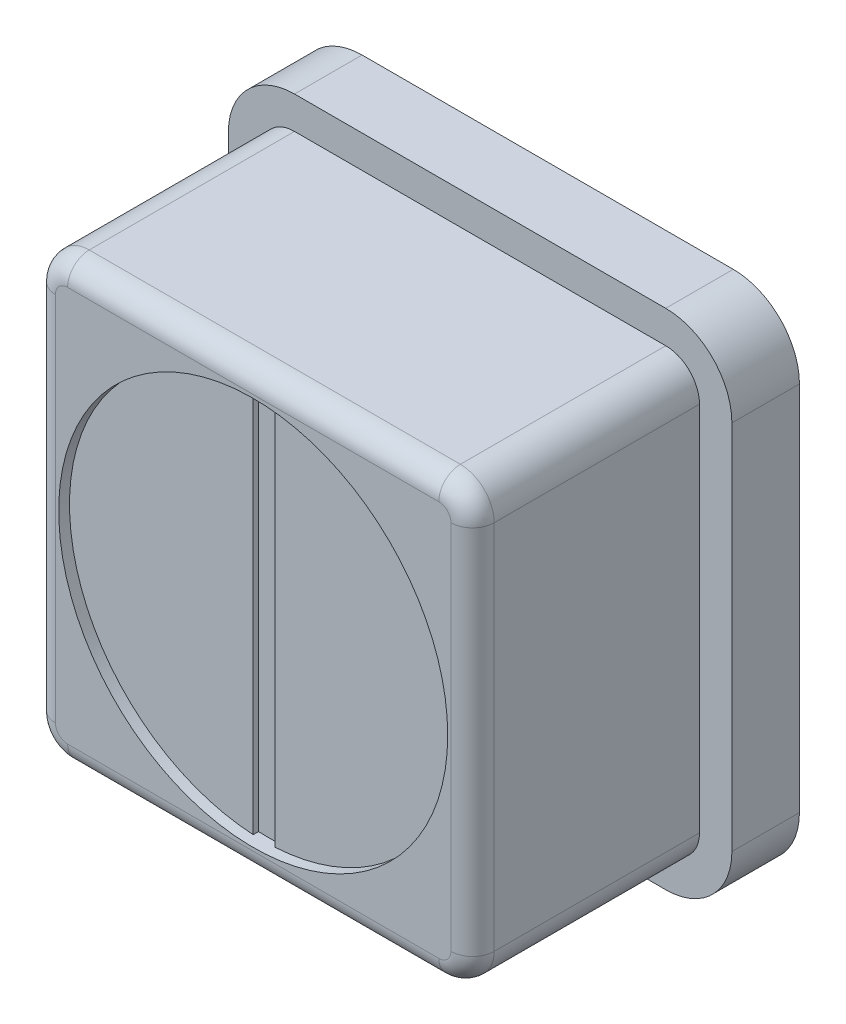
ISO-10303-21;
HEADER;
FILE_DESCRIPTION(('STEP AP214'),'2;1');
FILE_NAME('part.step','',(''),(''),'','','');
FILE_SCHEMA(('AUTOMOTIVE_DESIGN { 1 0 10303 214 1 1 1 1 }'));
ENDSEC;
DATA;
#1=APPLICATION_CONTEXT('core data for automotive mechanical design processes');
#2=APPLICATION_PROTOCOL_DEFINITION('international standard','automotive_design',2000,#1);
#3=PRODUCT_CONTEXT('',#1,'mechanical');
#4=PRODUCT('Part','Part','',(#3));
#5=PRODUCT_RELATED_PRODUCT_CATEGORY('part','',(#4));
#6=PRODUCT_DEFINITION_FORMATION('','',#4);
#7=PRODUCT_DEFINITION_CONTEXT('part definition',#1,'design');
#8=PRODUCT_DEFINITION('design','',#6,#7);
#9=PRODUCT_DEFINITION_SHAPE('','',#8);
#10=(LENGTH_UNIT() NAMED_UNIT(*) SI_UNIT(.MILLI.,.METRE.));
#11=(NAMED_UNIT(*) PLANE_ANGLE_UNIT() SI_UNIT($,.RADIAN.));
#12=(NAMED_UNIT(*) SI_UNIT($,.STERADIAN.) SOLID_ANGLE_UNIT());
#13=UNCERTAINTY_MEASURE_WITH_UNIT(LENGTH_MEASURE(1.E-05),#10,'distance_accuracy_value','');
#14=(GEOMETRIC_REPRESENTATION_CONTEXT(3) GLOBAL_UNCERTAINTY_ASSIGNED_CONTEXT((#13)) GLOBAL_UNIT_ASSIGNED_CONTEXT((#10,
#11,#12)) REPRESENTATION_CONTEXT('',''));
#15=CARTESIAN_POINT('',(0.,0.,0.));
#16=DIRECTION('',(0.,0.,1.));
#17=DIRECTION('',(1.,0.,0.));
#18=AXIS2_PLACEMENT_3D('',#15,#16,#17);
#19=CARTESIAN_POINT('',(0.,0.,-0.254000000000004));
#20=DIRECTION('',(0.,0.,1.));
#21=DIRECTION('',(1.,0.,0.));
#22=AXIS2_PLACEMENT_3D('',#19,#20,#21);
#23=PLANE('',#22);
#24=CARTESIAN_POINT('',(0.,0.,-0.254000000000004));
#25=DIRECTION('',(0.,0.,1.));
#26=DIRECTION('',(1.,0.,0.));
#27=AXIS2_PLACEMENT_3D('',#24,#25,#26);
#28=CIRCLE('',#27,4.572);
#29=CARTESIAN_POINT('',(-0.253999999999907,4.56493899192506,-0.25399999999999));
#30=VERTEX_POINT('',#29);
#31=CARTESIAN_POINT('',(-0.254000000000011,-4.56493899192553,-0.253999999999997));
#32=VERTEX_POINT('',#31);
#33=EDGE_CURVE('E357',#30,#32,#28,.T.);
#34=ORIENTED_EDGE('',*,*,#33,.T.);
#35=DIRECTION('',(0.,1.,0.));
#36=VECTOR('',#35,1.);
#37=CARTESIAN_POINT('',(-0.254000000000018,-2.35922392732846E-13,-0.253999999999997));
#38=LINE('',#37,#36);
#39=EDGE_CURVE('E301',#32,#30,#38,.T.);
#40=ORIENTED_EDGE('',*,*,#39,.T.);
#41=EDGE_LOOP('',(#34,#40));
#42=FACE_BOUND('',#41,.T.);
#43=ADVANCED_FACE('F55',(#42),#23,.T.);
#44=CARTESIAN_POINT('',(4.3624499538877,4.36244995397701,-5.33399999999997));
#45=DIRECTION('',(0.,0.,1.));
#46=DIRECTION('',(1.,0.,0.));
#47=AXIS2_PLACEMENT_3D('',#44,#45,#46);
#48=CYLINDRICAL_SURFACE('',#47,0.793750000000093);
#49=DIRECTION('',(0.,0.,1.));
#50=VECTOR('',#49,1.);
#51=CARTESIAN_POINT('',(4.3624468932103,5.15619995397119,-5.33399999999997));
#52=LINE('',#51,#50);
#53=CARTESIAN_POINT('',(4.3624468932103,5.15619995397119,-5.33399999999997));
#54=VERTEX_POINT('',#53);
#55=CARTESIAN_POINT('',(4.3624468932103,5.15619995397122,-0.50799999999996));
#56=VERTEX_POINT('',#55);
#57=EDGE_CURVE('E439',#54,#56,#52,.T.);
#58=ORIENTED_EDGE('',*,*,#57,.T.);
#59=CARTESIAN_POINT('',(4.3624499538877,4.36244995397701,-0.507999999999974));
#60=DIRECTION('',(0.,0.,1.));
#61=DIRECTION('',(1.,0.,0.));
#62=AXIS2_PLACEMENT_3D('',#59,#60,#61);
#63=CIRCLE('',#62,0.793750000000093);
#64=CARTESIAN_POINT('',(5.15619995388178,4.36244689321312,-0.507999999999974));
#65=VERTEX_POINT('',#64);
#66=EDGE_CURVE('E13',#56,#65,#63,.F.);
#67=ORIENTED_EDGE('',*,*,#66,.T.);
#68=DIRECTION('',(0.,0.,1.));
#69=VECTOR('',#68,1.);
#70=CARTESIAN_POINT('',(5.15619995388179,4.36244689321312,-5.33399999999997));
#71=LINE('',#70,#69);
#72=CARTESIAN_POINT('',(5.15619995388179,4.36244689321312,-5.33399999999997));
#73=VERTEX_POINT('',#72);
#74=EDGE_CURVE('E438',#73,#65,#71,.T.);
#75=ORIENTED_EDGE('',*,*,#74,.F.);
#76=CARTESIAN_POINT('',(4.3624499538877,4.36244995397701,-5.33399999999997));
#77=DIRECTION('',(0.,0.,1.));
#78=DIRECTION('',(1.,0.,0.));
#79=AXIS2_PLACEMENT_3D('',#76,#77,#78);
#80=CIRCLE('',#79,0.793750000000093);
#81=EDGE_CURVE('E365',#73,#54,#80,.T.);
#82=ORIENTED_EDGE('',*,*,#81,.T.);
#83=EDGE_LOOP('',(#58,#67,#75,#82));
#84=FACE_BOUND('',#83,.T.);
#85=ADVANCED_FACE('F564',(#84),#48,.T.);
#86=CARTESIAN_POINT('',(5.15619995388188,-4.36244689320725,-5.33399999999997));
#87=DIRECTION('',(1.,0.,0.));
#88=DIRECTION('',(0.,1.,0.));
#89=AXIS2_PLACEMENT_3D('',#86,#87,#88);
#90=PLANE('',#89);
#91=ORIENTED_EDGE('',*,*,#74,.T.);
#92=DIRECTION('',(0.,1.,0.));
#93=VECTOR('',#92,1.);
#94=CARTESIAN_POINT('',(5.15619995388187,-4.36244689320725,-0.507999999999967));
#95=LINE('',#94,#93);
#96=CARTESIAN_POINT('',(5.15619995388187,-4.36244689320725,-0.507999999999967));
#97=VERTEX_POINT('',#96);
#98=EDGE_CURVE('E409',#65,#97,#95,.F.);
#99=ORIENTED_EDGE('',*,*,#98,.T.);
#100=DIRECTION('',(0.,0.,1.));
#101=VECTOR('',#100,1.);
#102=CARTESIAN_POINT('',(5.15619995388188,-4.36244689320725,-5.33399999999997));
#103=LINE('',#102,#101);
#104=CARTESIAN_POINT('',(5.15619995388188,-4.36244689320725,-5.33399999999997));
#105=VERTEX_POINT('',#104);
#106=EDGE_CURVE('E462',#105,#97,#103,.T.);
#107=ORIENTED_EDGE('',*,*,#106,.F.);
#108=DIRECTION('',(0.,1.,0.));
#109=VECTOR('',#108,1.);
#110=CARTESIAN_POINT('',(5.15619995388188,-4.36244689320725,-5.33399999999997));
#111=LINE('',#110,#109);
#112=EDGE_CURVE('E443',#105,#73,#111,.T.);
#113=ORIENTED_EDGE('',*,*,#112,.T.);
#114=EDGE_LOOP('',(#91,#99,#107,#113));
#115=FACE_BOUND('',#114,.T.);
#116=ADVANCED_FACE('F561',(#115),#90,.T.);
#117=CARTESIAN_POINT('',(4.3624499538876,-4.36244995397112,-5.33399999999997));
#118=DIRECTION('',(0.,0.,1.));
#119=DIRECTION('',(1.,0.,0.));
#120=AXIS2_PLACEMENT_3D('',#117,#118,#119);
#121=CYLINDRICAL_SURFACE('',#120,0.793750000000093);
#122=ORIENTED_EDGE('',*,*,#106,.T.);
#123=CARTESIAN_POINT('',(4.36244995388758,-4.36244995397112,-0.507999999999967));
#124=DIRECTION('',(0.,0.,1.));
#125=DIRECTION('',(1.,0.,0.));
#126=AXIS2_PLACEMENT_3D('',#123,#124,#125);
#127=CIRCLE('',#126,0.793750000000093);
#128=CARTESIAN_POINT('',(4.36244988671362,-5.15619995397121,-0.507999999999967));
#129=VERTEX_POINT('',#128);
#130=EDGE_CURVE('E406',#97,#129,#127,.F.);
#131=ORIENTED_EDGE('',*,*,#130,.T.);
#132=DIRECTION('',(0.,0.,1.));
#133=VECTOR('',#132,1.);
#134=CARTESIAN_POINT('',(4.36244988671364,-5.15619995397121,-5.33399999999997));
#135=LINE('',#134,#133);
#136=CARTESIAN_POINT('',(4.36244988671364,-5.15619995397121,-5.33399999999997));
#137=VERTEX_POINT('',#136);
#138=EDGE_CURVE('E458',#137,#129,#135,.T.);
#139=ORIENTED_EDGE('',*,*,#138,.F.);
#140=CARTESIAN_POINT('',(4.3624499538876,-4.36244995397112,-5.33399999999997));
#141=DIRECTION('',(0.,0.,1.));
#142=DIRECTION('',(1.,0.,0.));
#143=AXIS2_PLACEMENT_3D('',#140,#141,#142);
#144=CIRCLE('',#143,0.793750000000093);
#145=EDGE_CURVE('E471',#137,#105,#144,.T.);
#146=ORIENTED_EDGE('',*,*,#145,.T.);
#147=EDGE_LOOP('',(#122,#131,#139,#146));
#148=FACE_BOUND('',#147,.T.);
#149=ADVANCED_FACE('F559',(#148),#121,.T.);
#150=CARTESIAN_POINT('',(-4.36244988671361,-5.15619995397121,-5.334));
#151=DIRECTION('',(0.,-1.,0.));
#152=DIRECTION('',(0.,0.,-1.));
#153=AXIS2_PLACEMENT_3D('',#150,#151,#152);
#154=PLANE('',#153);
#155=ORIENTED_EDGE('',*,*,#138,.T.);
#156=DIRECTION('',(1.,0.,0.));
#157=VECTOR('',#156,1.);
#158=CARTESIAN_POINT('',(-4.36244988671362,-5.15619995397121,-0.507999999999988));
#159=LINE('',#158,#157);
#160=CARTESIAN_POINT('',(-4.36244988671362,-5.15619995397121,-0.507999999999988));
#161=VERTEX_POINT('',#160);
#162=EDGE_CURVE('E403',#129,#161,#159,.F.);
#163=ORIENTED_EDGE('',*,*,#162,.T.);
#164=DIRECTION('',(0.,0.,1.));
#165=VECTOR('',#164,1.);
#166=CARTESIAN_POINT('',(-4.36244988671361,-5.15619995397121,-5.334));
#167=LINE('',#166,#165);
#168=CARTESIAN_POINT('',(-4.36244988671361,-5.15619995397121,-5.334));
#169=VERTEX_POINT('',#168);
#170=EDGE_CURVE('E454',#169,#161,#167,.T.);
#171=ORIENTED_EDGE('',*,*,#170,.F.);
#172=DIRECTION('',(1.,0.,0.));
#173=VECTOR('',#172,1.);
#174=CARTESIAN_POINT('',(-4.36244988671361,-5.15619995397121,-5.334));
#175=LINE('',#174,#173);
#176=EDGE_CURVE('E475',#169,#137,#175,.T.);
#177=ORIENTED_EDGE('',*,*,#176,.T.);
#178=EDGE_LOOP('',(#155,#163,#171,#177));
#179=FACE_BOUND('',#178,.T.);
#180=ADVANCED_FACE('F548',(#179),#154,.T.);
#181=CARTESIAN_POINT('',(-4.36244995391178,-4.36244995397112,-5.334));
#182=DIRECTION('',(0.,0.,1.));
#183=DIRECTION('',(1.,0.,0.));
#184=AXIS2_PLACEMENT_3D('',#181,#182,#183);
#185=CYLINDRICAL_SURFACE('',#184,0.793750000000093);
#186=ORIENTED_EDGE('',*,*,#170,.T.);
#187=CARTESIAN_POINT('',(-4.36244995391179,-4.36244995397112,-0.507999999999995));
#188=DIRECTION('',(0.,0.,1.));
#189=DIRECTION('',(1.,0.,0.));
#190=AXIS2_PLACEMENT_3D('',#187,#188,#189);
#191=CIRCLE('',#190,0.793750000000093);
#192=CARTESIAN_POINT('',(-5.15619995390598,-4.36245301467375,-0.508000000000002));
#193=VERTEX_POINT('',#192);
#194=EDGE_CURVE('E400',#161,#193,#191,.F.);
#195=ORIENTED_EDGE('',*,*,#194,.T.);
#196=DIRECTION('',(0.,0.,1.));
#197=VECTOR('',#196,1.);
#198=CARTESIAN_POINT('',(-5.15619995390595,-4.36245301467375,-5.334));
#199=LINE('',#198,#197);
#200=CARTESIAN_POINT('',(-5.15619995390595,-4.36245301467375,-5.334));
#201=VERTEX_POINT('',#200);
#202=EDGE_CURVE('E450',#201,#193,#199,.T.);
#203=ORIENTED_EDGE('',*,*,#202,.F.);
#204=CARTESIAN_POINT('',(-4.36244995391178,-4.36244995397112,-5.334));
#205=DIRECTION('',(0.,0.,1.));
#206=DIRECTION('',(1.,0.,0.));
#207=AXIS2_PLACEMENT_3D('',#204,#205,#206);
#208=CIRCLE('',#207,0.793750000000093);
#209=EDGE_CURVE('E479',#201,#169,#208,.T.);
#210=ORIENTED_EDGE('',*,*,#209,.T.);
#211=EDGE_LOOP('',(#186,#195,#203,#210));
#212=FACE_BOUND('',#211,.T.);
#213=ADVANCED_FACE('F551',(#212),#185,.T.);
#214=CARTESIAN_POINT('',(-5.15619995390595,4.36245301467375,-5.334));
#215=DIRECTION('',(-1.,0.,0.));
#216=DIRECTION('',(0.,0.,1.));
#217=AXIS2_PLACEMENT_3D('',#214,#215,#216);
#218=PLANE('',#217);
#219=ORIENTED_EDGE('',*,*,#202,.T.);
#220=DIRECTION('',(0.,-1.,0.));
#221=VECTOR('',#220,1.);
#222=CARTESIAN_POINT('',(-5.15619995390598,4.36245301467375,-0.508000000000002));
#223=LINE('',#222,#221);
#224=CARTESIAN_POINT('',(-5.15619995390598,4.36245301467375,-0.508000000000002));
#225=VERTEX_POINT('',#224);
#226=EDGE_CURVE('E397',#193,#225,#223,.F.);
#227=ORIENTED_EDGE('',*,*,#226,.T.);
#228=DIRECTION('',(0.,0.,1.));
#229=VECTOR('',#228,1.);
#230=CARTESIAN_POINT('',(-5.15619995390595,4.36245301467375,-5.334));
#231=LINE('',#230,#229);
#232=CARTESIAN_POINT('',(-5.15619995391177,4.36244995397701,-5.334));
#233=VERTEX_POINT('',#232);
#234=EDGE_CURVE('E446',#233,#225,#231,.T.);
#235=ORIENTED_EDGE('',*,*,#234,.F.);
#236=DIRECTION('',(0.,-1.,0.));
#237=VECTOR('',#236,1.);
#238=CARTESIAN_POINT('',(-5.15619995390595,4.36245301467375,-5.334));
#239=LINE('',#238,#237);
#240=EDGE_CURVE('E483',#233,#201,#239,.T.);
#241=ORIENTED_EDGE('',*,*,#240,.T.);
#242=EDGE_LOOP('',(#219,#227,#235,#241));
#243=FACE_BOUND('',#242,.T.);
#244=ADVANCED_FACE('F569',(#243),#218,.T.);
#245=CARTESIAN_POINT('',(-4.36244995391168,4.36244995397701,-5.334));
#246=DIRECTION('',(0.,0.,1.));
#247=DIRECTION('',(1.,0.,0.));
#248=AXIS2_PLACEMENT_3D('',#245,#246,#247);
#249=CYLINDRICAL_SURFACE('',#248,0.793750000000093);
#250=ORIENTED_EDGE('',*,*,#234,.T.);
#251=CARTESIAN_POINT('',(-4.36244995391168,4.36244995397701,-0.508000000000002));
#252=DIRECTION('',(0.,0.,1.));
#253=DIRECTION('',(1.,0.,0.));
#254=AXIS2_PLACEMENT_3D('',#251,#252,#253);
#255=CIRCLE('',#254,0.793750000000093);
#256=CARTESIAN_POINT('',(-4.36244689321006,5.15619995397117,-0.507999999999995));
#257=VERTEX_POINT('',#256);
#258=EDGE_CURVE('E394',#225,#257,#255,.F.);
#259=ORIENTED_EDGE('',*,*,#258,.T.);
#260=DIRECTION('',(0.,0.,1.));
#261=VECTOR('',#260,1.);
#262=CARTESIAN_POINT('',(-4.36244689321006,5.15619995397103,-5.334));
#263=LINE('',#262,#261);
#264=CARTESIAN_POINT('',(-4.36244689321006,5.15619995397103,-5.334));
#265=VERTEX_POINT('',#264);
#266=EDGE_CURVE('E442',#265,#257,#263,.T.);
#267=ORIENTED_EDGE('',*,*,#266,.F.);
#268=CARTESIAN_POINT('',(-4.36244995391168,4.36244995397701,-5.334));
#269=DIRECTION('',(0.,0.,1.));
#270=DIRECTION('',(1.,0.,0.));
#271=AXIS2_PLACEMENT_3D('',#268,#269,#270);
#272=CIRCLE('',#271,0.793750000000093);
#273=EDGE_CURVE('E487',#265,#233,#272,.T.);
#274=ORIENTED_EDGE('',*,*,#273,.T.);
#275=EDGE_LOOP('',(#250,#259,#267,#274));
#276=FACE_BOUND('',#275,.T.);
#277=ADVANCED_FACE('F567',(#276),#249,.T.);
#278=CARTESIAN_POINT('',(4.3624468932103,5.15619995397119,-5.33399999999997));
#279=DIRECTION('',(0.,1.,0.));
#280=DIRECTION('',(0.,0.,1.));
#281=AXIS2_PLACEMENT_3D('',#278,#279,#280);
#282=PLANE('',#281);
#283=ORIENTED_EDGE('',*,*,#266,.T.);
#284=DIRECTION('',(-1.,0.,0.));
#285=VECTOR('',#284,1.);
#286=CARTESIAN_POINT('',(4.3624468932103,5.15619995397122,-0.50799999999996));
#287=LINE('',#286,#285);
#288=EDGE_CURVE('E65',#257,#56,#287,.F.);
#289=ORIENTED_EDGE('',*,*,#288,.T.);
#290=ORIENTED_EDGE('',*,*,#57,.F.);
#291=DIRECTION('',(-1.,0.,0.));
#292=VECTOR('',#291,1.);
#293=CARTESIAN_POINT('',(4.3624468932103,5.15619995397119,-5.33399999999997));
#294=LINE('',#293,#292);
#295=EDGE_CURVE('E491',#54,#265,#294,.T.);
#296=ORIENTED_EDGE('',*,*,#295,.T.);
#297=EDGE_LOOP('',(#283,#289,#290,#296));
#298=FACE_BOUND('',#297,.T.);
#299=ADVANCED_FACE('F506',(#298),#282,.T.);
#300=CARTESIAN_POINT('',(4.3624499538877,4.36244995397701,0.));
#301=DIRECTION('',(0.,0.,1.));
#302=DIRECTION('',(1.,0.,0.));
#303=AXIS2_PLACEMENT_3D('',#300,#301,#302);
#304=PLANE('',#303);
#305=CARTESIAN_POINT('',(0.,0.,0.));
#306=DIRECTION('',(0.,0.,1.));
#307=DIRECTION('',(1.,0.,0.));
#308=AXIS2_PLACEMENT_3D('',#305,#306,#307);
#309=CIRCLE('',#308,4.572);
#310=CARTESIAN_POINT('',(4.57199999999999,0.,0.));
#311=VERTEX_POINT('',#310);
#312=EDGE_CURVE('E347',#311,#311,#309,.T.);
#313=ORIENTED_EDGE('',*,*,#312,.F.);
#314=EDGE_LOOP('',(#313));
#315=FACE_BOUND('',#314,.T.);
#316=CARTESIAN_POINT('',(4.36244995388758,-4.36244995397112,0.));
#317=DIRECTION('',(0.,0.,1.));
#318=DIRECTION('',(1.,0.,0.));
#319=AXIS2_PLACEMENT_3D('',#316,#317,#318);
#320=CIRCLE('',#319,0.285750000000093);
#321=CARTESIAN_POINT('',(4.36244992970496,-4.64819995397121,0.));
#322=VERTEX_POINT('',#321);
#323=CARTESIAN_POINT('',(4.64819995387135,-4.36244689320703,0.));
#324=VERTEX_POINT('',#323);
#325=EDGE_CURVE('E417',#322,#324,#320,.T.);
#326=ORIENTED_EDGE('',*,*,#325,.T.);
#327=DIRECTION('',(0.,1.,0.));
#328=VECTOR('',#327,1.);
#329=CARTESIAN_POINT('',(4.6481999538819,4.36244995397723,0.));
#330=LINE('',#329,#328);
#331=CARTESIAN_POINT('',(4.64819995387128,4.36244689321334,0.));
#332=VERTEX_POINT('',#331);
#333=EDGE_CURVE('E413',#324,#332,#330,.T.);
#334=ORIENTED_EDGE('',*,*,#333,.T.);
#335=CARTESIAN_POINT('',(4.3624499538877,4.36244995397701,0.));
#336=DIRECTION('',(0.,0.,1.));
#337=DIRECTION('',(1.,0.,0.));
#338=AXIS2_PLACEMENT_3D('',#335,#336,#337);
#339=CIRCLE('',#338,0.285750000000093);
#340=CARTESIAN_POINT('',(4.3624468932103,4.64819995396072,0.));
#341=VERTEX_POINT('',#340);
#342=EDGE_CURVE('E435',#332,#341,#339,.T.);
#343=ORIENTED_EDGE('',*,*,#342,.T.);
#344=DIRECTION('',(-1.,0.,0.));
#345=VECTOR('',#344,1.);
#346=CARTESIAN_POINT('',(4.3624499538877,4.64819995397119,0.));
#347=LINE('',#346,#345);
#348=CARTESIAN_POINT('',(-4.36244885205909,4.64819995397121,0.));
#349=VERTEX_POINT('',#348);
#350=EDGE_CURVE('E432',#341,#349,#347,.T.);
#351=ORIENTED_EDGE('',*,*,#350,.T.);
#352=CARTESIAN_POINT('',(-4.36244995391168,4.36244995397701,0.));
#353=DIRECTION('',(0.,0.,1.));
#354=DIRECTION('',(1.,0.,0.));
#355=AXIS2_PLACEMENT_3D('',#352,#353,#354);
#356=CIRCLE('',#355,0.285750000000093);
#357=CARTESIAN_POINT('',(-4.64819995389549,4.36245301467363,0.));
#358=VERTEX_POINT('',#357);
#359=EDGE_CURVE('E429',#349,#358,#356,.T.);
#360=ORIENTED_EDGE('',*,*,#359,.T.);
#361=DIRECTION('',(0.,-1.,0.));
#362=VECTOR('',#361,1.);
#363=CARTESIAN_POINT('',(-4.64819995390586,4.36244995397689,0.));
#364=LINE('',#363,#362);
#365=CARTESIAN_POINT('',(-4.64819995390586,-4.3624510558242,0.));
#366=VERTEX_POINT('',#365);
#367=EDGE_CURVE('E426',#358,#366,#364,.T.);
#368=ORIENTED_EDGE('',*,*,#367,.T.);
#369=CARTESIAN_POINT('',(-4.36244995391179,-4.36244995397112,0.));
#370=DIRECTION('',(0.,0.,1.));
#371=DIRECTION('',(1.,0.,0.));
#372=AXIS2_PLACEMENT_3D('',#369,#370,#371);
#373=CIRCLE('',#372,0.285750000000093);
#374=CARTESIAN_POINT('',(-4.36244988671362,-4.6481999539712,0.));
#375=VERTEX_POINT('',#374);
#376=EDGE_CURVE('E423',#366,#375,#373,.T.);
#377=ORIENTED_EDGE('',*,*,#376,.T.);
#378=DIRECTION('',(1.,0.,0.));
#379=VECTOR('',#378,1.);
#380=CARTESIAN_POINT('',(4.36244995388758,-4.64819995397121,0.));
#381=LINE('',#380,#379);
#382=EDGE_CURVE('E420',#375,#322,#381,.T.);
#383=ORIENTED_EDGE('',*,*,#382,.T.);
#384=EDGE_LOOP('',(#326,#334,#343,#351,#360,#368,#377,#383));
#385=FACE_BOUND('',#384,.T.);
#386=ADVANCED_FACE('F503',(#315,#385),#304,.T.);
#387=CARTESIAN_POINT('',(-4.64819995390586,4.36244995397689,-0.508000000000002));
#388=DIRECTION('',(0.,-1.,0.));
#389=DIRECTION('',(0.,0.,-1.));
#390=AXIS2_PLACEMENT_3D('',#387,#388,#389);
#391=CYLINDRICAL_SURFACE('',#390,0.508);
#392=CARTESIAN_POINT('',(-4.64819995390598,4.36245301467363,-0.508000000000002));
#393=DIRECTION('',(0.,1.,0.));
#394=DIRECTION('',(0.,0.,1.));
#395=AXIS2_PLACEMENT_3D('',#392,#393,#394);
#396=CIRCLE('',#395,0.508);
#397=EDGE_CURVE('E366',#225,#358,#396,.T.);
#398=ORIENTED_EDGE('',*,*,#397,.F.);
#399=ORIENTED_EDGE('',*,*,#226,.F.);
#400=CARTESIAN_POINT('',(-4.64819995390586,-4.3624510558242,-0.507999999999995));
#401=DIRECTION('',(3.85600331326566E-06,-0.999999999992566,0.));
#402=DIRECTION('',(0.999999999992566,3.85600331326566E-06,0.));
#403=AXIS2_PLACEMENT_3D('',#400,#401,#402);
#404=CIRCLE('',#403,0.508);
#405=EDGE_CURVE('E360',#366,#193,#404,.T.);
#406=ORIENTED_EDGE('',*,*,#405,.F.);
#407=ORIENTED_EDGE('',*,*,#367,.F.);
#408=EDGE_LOOP('',(#398,#399,#406,#407));
#409=FACE_BOUND('',#408,.T.);
#410=ADVANCED_FACE('F57',(#409),#391,.T.);
#411=CARTESIAN_POINT('',(-4.36244995391179,-4.36244995397112,-0.507999999999995));
#412=DIRECTION('',(0.,0.,1.));
#413=DIRECTION('',(1.,0.,0.));
#414=AXIS2_PLACEMENT_3D('',#411,#412,#413);
#415=DEGENERATE_TOROIDAL_SURFACE('',#414,0.285750000000093,0.508,.T.);
#416=ORIENTED_EDGE('',*,*,#405,.T.);
#417=ORIENTED_EDGE('',*,*,#194,.F.);
#418=CARTESIAN_POINT('',(-4.36244988671362,-4.6481999539712,-0.507999999999988));
#419=DIRECTION('',(1.,0.,0.));
#420=DIRECTION('',(0.,0.,-1.));
#421=AXIS2_PLACEMENT_3D('',#418,#419,#420);
#422=CIRCLE('',#421,0.508);
#423=EDGE_CURVE('E370',#375,#161,#422,.T.);
#424=ORIENTED_EDGE('',*,*,#423,.F.);
#425=ORIENTED_EDGE('',*,*,#376,.F.);
#426=EDGE_LOOP('',(#416,#417,#424,#425));
#427=FACE_BOUND('',#426,.T.);
#428=ADVANCED_FACE('F542',(#427),#415,.T.);
#429=CARTESIAN_POINT('',(-4.36244995391168,4.36244995397701,-0.508000000000002));
#430=DIRECTION('',(0.,0.,1.));
#431=DIRECTION('',(1.,0.,0.));
#432=AXIS2_PLACEMENT_3D('',#429,#430,#431);
#433=DEGENERATE_TOROIDAL_SURFACE('',#432,0.285750000000093,0.508,.T.);
#434=ORIENTED_EDGE('',*,*,#397,.T.);
#435=ORIENTED_EDGE('',*,*,#359,.F.);
#436=CARTESIAN_POINT('',(-4.36244885205909,4.64819995397499,-0.507999999999995));
#437=DIRECTION('',(0.999999999992566,-3.85600202932577E-06,0.));
#438=DIRECTION('',(3.85600202932577E-06,0.999999999992566,0.));
#439=AXIS2_PLACEMENT_3D('',#436,#437,#438);
#440=CIRCLE('',#439,0.508);
#441=EDGE_CURVE('E374',#257,#349,#440,.T.);
#442=ORIENTED_EDGE('',*,*,#441,.F.);
#443=ORIENTED_EDGE('',*,*,#258,.F.);
#444=EDGE_LOOP('',(#434,#435,#442,#443));
#445=FACE_BOUND('',#444,.T.);
#446=ADVANCED_FACE('F532',(#445),#433,.T.);
#447=CARTESIAN_POINT('',(4.36244995388758,-4.64819995397121,-0.507999999999967));
#448=DIRECTION('',(1.,0.,0.));
#449=DIRECTION('',(0.,0.,-1.));
#450=AXIS2_PLACEMENT_3D('',#447,#448,#449);
#451=CYLINDRICAL_SURFACE('',#450,0.508);
#452=ORIENTED_EDGE('',*,*,#423,.T.);
#453=ORIENTED_EDGE('',*,*,#162,.F.);
#454=CARTESIAN_POINT('',(4.36244992970496,-4.64819995397121,-0.507999999999967));
#455=DIRECTION('',(0.999999999999997,-8.46286128309028E-08,0.));
#456=DIRECTION('',(8.46286128309028E-08,0.999999999999997,0.));
#457=AXIS2_PLACEMENT_3D('',#454,#455,#456);
#458=CIRCLE('',#457,0.508);
#459=EDGE_CURVE('E378',#322,#129,#458,.T.);
#460=ORIENTED_EDGE('',*,*,#459,.F.);
#461=ORIENTED_EDGE('',*,*,#382,.F.);
#462=EDGE_LOOP('',(#452,#453,#460,#461));
#463=FACE_BOUND('',#462,.T.);
#464=ADVANCED_FACE('F545',(#463),#451,.T.);
#465=CARTESIAN_POINT('',(4.3624499538877,4.64819995397119,-0.50799999999996));
#466=DIRECTION('',(-1.,0.,0.));
#467=DIRECTION('',(0.,0.,1.));
#468=AXIS2_PLACEMENT_3D('',#465,#466,#467);
#469=CYLINDRICAL_SURFACE('',#468,0.508);
#470=ORIENTED_EDGE('',*,*,#441,.T.);
#471=ORIENTED_EDGE('',*,*,#350,.F.);
#472=CARTESIAN_POINT('',(4.3624468932103,4.64819995397121,-0.50799999999996));
#473=DIRECTION('',(1.,0.,0.));
#474=DIRECTION('',(0.,0.,-1.));
#475=AXIS2_PLACEMENT_3D('',#472,#473,#474);
#476=CIRCLE('',#475,0.508);
#477=EDGE_CURVE('E382',#56,#341,#476,.T.);
#478=ORIENTED_EDGE('',*,*,#477,.F.);
#479=ORIENTED_EDGE('',*,*,#288,.F.);
#480=EDGE_LOOP('',(#470,#471,#478,#479));
#481=FACE_BOUND('',#480,.T.);
#482=ADVANCED_FACE('F528',(#481),#469,.T.);
#483=CARTESIAN_POINT('',(4.36244995388758,-4.36244995397112,-0.507999999999967));
#484=DIRECTION('',(0.,0.,1.));
#485=DIRECTION('',(1.,0.,0.));
#486=AXIS2_PLACEMENT_3D('',#483,#484,#485);
#487=DEGENERATE_TOROIDAL_SURFACE('',#486,0.285750000000093,0.508,.T.);
#488=ORIENTED_EDGE('',*,*,#459,.T.);
#489=ORIENTED_EDGE('',*,*,#130,.F.);
#490=CARTESIAN_POINT('',(4.64819995387135,-4.36244689320703,-0.507999999999967));
#491=DIRECTION('',(0.,1.,0.));
#492=DIRECTION('',(0.,0.,1.));
#493=AXIS2_PLACEMENT_3D('',#490,#491,#492);
#494=CIRCLE('',#493,0.508);
#495=EDGE_CURVE('E386',#324,#97,#494,.T.);
#496=ORIENTED_EDGE('',*,*,#495,.F.);
#497=ORIENTED_EDGE('',*,*,#325,.F.);
#498=EDGE_LOOP('',(#488,#489,#496,#497));
#499=FACE_BOUND('',#498,.T.);
#500=ADVANCED_FACE('F515',(#499),#487,.T.);
#501=CARTESIAN_POINT('',(4.3624499538877,4.36244995397701,-0.507999999999974));
#502=DIRECTION('',(0.,0.,1.));
#503=DIRECTION('',(1.,0.,0.));
#504=AXIS2_PLACEMENT_3D('',#501,#502,#503);
#505=DEGENERATE_TOROIDAL_SURFACE('',#504,0.285750000000093,0.508,.T.);
#506=ORIENTED_EDGE('',*,*,#477,.T.);
#507=ORIENTED_EDGE('',*,*,#342,.F.);
#508=CARTESIAN_POINT('',(4.64819995388567,4.36244885210223,-0.507999999999974));
#509=DIRECTION('',(-3.85608050504553E-06,-0.999999999985131,-3.85608050512517E-06));
#510=DIRECTION('',(0.,3.85608050515384E-06,-0.999999999992566));
#511=AXIS2_PLACEMENT_3D('',#508,#509,#510);
#512=CIRCLE('',#511,0.508);
#513=EDGE_CURVE('E389',#65,#332,#512,.T.);
#514=ORIENTED_EDGE('',*,*,#513,.F.);
#515=ORIENTED_EDGE('',*,*,#66,.F.);
#516=EDGE_LOOP('',(#506,#507,#514,#515));
#517=FACE_BOUND('',#516,.T.);
#518=ADVANCED_FACE('F523',(#517),#505,.T.);
#519=CARTESIAN_POINT('',(4.6481999538819,4.36244995397723,-0.507999999999974));
#520=DIRECTION('',(0.,1.,0.));
#521=DIRECTION('',(-1.,0.,0.));
#522=AXIS2_PLACEMENT_3D('',#519,#520,#521);
#523=CYLINDRICAL_SURFACE('',#522,0.508);
#524=ORIENTED_EDGE('',*,*,#495,.T.);
#525=ORIENTED_EDGE('',*,*,#98,.F.);
#526=ORIENTED_EDGE('',*,*,#513,.T.);
#527=ORIENTED_EDGE('',*,*,#333,.F.);
#528=EDGE_LOOP('',(#524,#525,#526,#527));
#529=FACE_BOUND('',#528,.T.);
#530=ADVANCED_FACE('F518',(#529),#523,.T.);
#531=CARTESIAN_POINT('',(0.,0.,-0.254000000000004));
#532=DIRECTION('',(0.,0.,1.));
#533=DIRECTION('',(1.,0.,0.));
#534=AXIS2_PLACEMENT_3D('',#531,#532,#533);
#535=CYLINDRICAL_SURFACE('',#534,4.572);
#536=ORIENTED_EDGE('',*,*,#33,.F.);
#537=DIRECTION('',(0.,0.,1.));
#538=VECTOR('',#537,1.);
#539=CARTESIAN_POINT('',(-0.253999999999907,4.56493899192506,-0.380999999999992));
#540=LINE('',#539,#538);
#541=CARTESIAN_POINT('',(-0.253999999999907,4.56493899192506,-0.380999999999992));
#542=VERTEX_POINT('',#541);
#543=EDGE_CURVE('E76',#542,#30,#540,.T.);
#544=ORIENTED_EDGE('',*,*,#543,.F.);
#545=CARTESIAN_POINT('',(0.,0.,-0.381000000000006));
#546=DIRECTION('',(0.,0.,1.));
#547=DIRECTION('',(1.,0.,0.));
#548=AXIS2_PLACEMENT_3D('',#545,#546,#547);
#549=CIRCLE('',#548,4.572);
#550=CARTESIAN_POINT('',(0.254000000000101,4.56493899192552,-0.380999999999992));
#551=VERTEX_POINT('',#550);
#552=EDGE_CURVE('E313',#551,#542,#549,.T.);
#553=ORIENTED_EDGE('',*,*,#552,.F.);
#554=DIRECTION('',(0.,0.,1.));
#555=VECTOR('',#554,1.);
#556=CARTESIAN_POINT('',(0.254000000000101,4.56493899192552,-0.380999999999992));
#557=LINE('',#556,#555);
#558=CARTESIAN_POINT('',(0.254000000000101,4.56493899192552,-0.25399999999999));
#559=VERTEX_POINT('',#558);
#560=EDGE_CURVE('E328',#551,#559,#557,.T.);
#561=ORIENTED_EDGE('',*,*,#560,.T.);
#562=CARTESIAN_POINT('',(0.253999999999983,-4.56493899192507,-0.253999999999997));
#563=VERTEX_POINT('',#562);
#564=EDGE_CURVE('E352',#563,#559,#28,.T.);
#565=ORIENTED_EDGE('',*,*,#564,.F.);
#566=DIRECTION('',(0.,0.,1.));
#567=VECTOR('',#566,1.);
#568=CARTESIAN_POINT('',(0.253999999999983,-4.56493899192507,-0.380999999999999));
#569=LINE('',#568,#567);
#570=CARTESIAN_POINT('',(0.253999999999983,-4.56493899192507,-0.380999999999999));
#571=VERTEX_POINT('',#570);
#572=EDGE_CURVE('E320',#571,#563,#569,.T.);
#573=ORIENTED_EDGE('',*,*,#572,.F.);
#574=CARTESIAN_POINT('',(-0.254000000000011,-4.56493899192553,-0.380999999999999));
#575=VERTEX_POINT('',#574);
#576=EDGE_CURVE('E308',#575,#571,#549,.T.);
#577=ORIENTED_EDGE('',*,*,#576,.F.);
#578=DIRECTION('',(0.,0.,1.));
#579=VECTOR('',#578,1.);
#580=CARTESIAN_POINT('',(-0.254000000000011,-4.56493899192553,-0.380999999999999));
#581=LINE('',#580,#579);
#582=EDGE_CURVE('E335',#575,#32,#581,.T.);
#583=ORIENTED_EDGE('',*,*,#582,.T.);
#584=EDGE_LOOP('',(#536,#544,#553,#561,#565,#573,#577,#583));
#585=FACE_BOUND('',#584,.T.);
#586=ORIENTED_EDGE('',*,*,#312,.T.);
#587=EDGE_LOOP('',(#586));
#588=FACE_BOUND('',#587,.T.);
#589=ADVANCED_FACE('F501',(#585,#588),#535,.F.);
#590=DIRECTION('',(0.,1.,0.));
#591=VECTOR('',#590,1.);
#592=CARTESIAN_POINT('',(0.253999999999983,2.22044604925031E-13,-0.253999999999997));
#593=LINE('',#592,#591);
#594=EDGE_CURVE('E296',#563,#559,#593,.T.);
#595=ORIENTED_EDGE('',*,*,#594,.F.);
#596=ORIENTED_EDGE('',*,*,#564,.T.);
#597=EDGE_LOOP('',(#595,#596));
#598=FACE_BOUND('',#597,.T.);
#599=ADVANCED_FACE('F581',(#598),#23,.T.);
#600=CARTESIAN_POINT('',(-0.254000000000018,-2.35922392732846E-13,-0.380999999999999));
#601=DIRECTION('',(1.,0.,0.));
#602=DIRECTION('',(0.,1.,0.));
#603=AXIS2_PLACEMENT_3D('',#600,#601,#602);
#604=PLANE('',#603);
#605=ORIENTED_EDGE('',*,*,#39,.F.);
#606=ORIENTED_EDGE('',*,*,#582,.F.);
#607=DIRECTION('',(0.,1.,0.));
#608=VECTOR('',#607,1.);
#609=CARTESIAN_POINT('',(-0.254000000000018,-2.35922392732846E-13,-0.380999999999999));
#610=LINE('',#609,#608);
#611=EDGE_CURVE('E317',#575,#542,#610,.T.);
#612=ORIENTED_EDGE('',*,*,#611,.T.);
#613=ORIENTED_EDGE('',*,*,#543,.T.);
#614=EDGE_LOOP('',(#605,#606,#612,#613));
#615=FACE_BOUND('',#614,.T.);
#616=ADVANCED_FACE('F590',(#615),#604,.T.);
#617=CARTESIAN_POINT('',(0.253999999999983,2.22044604925031E-13,-0.380999999999999));
#618=DIRECTION('',(1.,0.,0.));
#619=DIRECTION('',(0.,0.,-1.));
#620=AXIS2_PLACEMENT_3D('',#617,#618,#619);
#621=PLANE('',#620);
#622=ORIENTED_EDGE('',*,*,#594,.T.);
#623=ORIENTED_EDGE('',*,*,#560,.F.);
#624=DIRECTION('',(0.,1.,0.));
#625=VECTOR('',#624,1.);
#626=CARTESIAN_POINT('',(0.253999999999983,2.22044604925031E-13,-0.380999999999999));
#627=LINE('',#626,#625);
#628=EDGE_CURVE('E312',#571,#551,#627,.T.);
#629=ORIENTED_EDGE('',*,*,#628,.F.);
#630=ORIENTED_EDGE('',*,*,#572,.T.);
#631=EDGE_LOOP('',(#622,#623,#629,#630));
#632=FACE_BOUND('',#631,.T.);
#633=ADVANCED_FACE('F596',(#632),#621,.F.);
#634=CARTESIAN_POINT('',(0.,0.,-0.381000000000006));
#635=DIRECTION('',(0.,0.,1.));
#636=DIRECTION('',(1.,0.,0.));
#637=AXIS2_PLACEMENT_3D('',#634,#635,#636);
#638=PLANE('',#637);
#639=ORIENTED_EDGE('',*,*,#576,.T.);
#640=ORIENTED_EDGE('',*,*,#628,.T.);
#641=ORIENTED_EDGE('',*,*,#552,.T.);
#642=ORIENTED_EDGE('',*,*,#611,.F.);
#643=EDGE_LOOP('',(#639,#640,#641,#642));
#644=FACE_BOUND('',#643,.T.);
#645=ADVANCED_FACE('F603',(#644),#638,.T.);
#646=CARTESIAN_POINT('',(4.3624499538877,4.36244995397701,-6.92149999999996));
#647=DIRECTION('',(0.,0.,1.));
#648=DIRECTION('',(1.,0.,0.));
#649=AXIS2_PLACEMENT_3D('',#646,#647,#648);
#650=CYLINDRICAL_SURFACE('',#649,1.55575000000009);
#651=CARTESIAN_POINT('',(4.3624499538877,4.36244995397701,-5.33399999999997));
#652=DIRECTION('',(0.,0.,-1.));
#653=DIRECTION('',(-1.,0.,0.));
#654=AXIS2_PLACEMENT_3D('',#651,#652,#653);
#655=CIRCLE('',#654,1.55575000000009);
#656=CARTESIAN_POINT('',(4.36244395495999,5.91819995396538,-5.33399999999997));
#657=VERTEX_POINT('',#656);
#658=CARTESIAN_POINT('',(5.91819995387623,4.36244395487964,-5.33399999999997));
#659=VERTEX_POINT('',#658);
#660=EDGE_CURVE('E294',#657,#659,#655,.T.);
#661=ORIENTED_EDGE('',*,*,#660,.T.);
#662=DIRECTION('',(0.,0.,1.));
#663=VECTOR('',#662,1.);
#664=CARTESIAN_POINT('',(5.91819995387623,4.36244395487964,-6.92149999999997));
#665=LINE('',#664,#663);
#666=CARTESIAN_POINT('',(5.91819995387623,4.36244395487964,-6.92149999999997));
#667=VERTEX_POINT('',#666);
#668=EDGE_CURVE('E272',#667,#659,#665,.T.);
#669=ORIENTED_EDGE('',*,*,#668,.F.);
#670=CARTESIAN_POINT('',(4.3624499538877,4.36244995397701,-6.92149999999996));
#671=DIRECTION('',(0.,0.,-1.));
#672=DIRECTION('',(-1.,0.,0.));
#673=AXIS2_PLACEMENT_3D('',#670,#671,#672);
#674=CIRCLE('',#673,1.55575000000009);
#675=CARTESIAN_POINT('',(4.36244395495999,5.91819995396538,-6.92149999999997));
#676=VERTEX_POINT('',#675);
#677=EDGE_CURVE('E280',#676,#667,#674,.T.);
#678=ORIENTED_EDGE('',*,*,#677,.F.);
#679=DIRECTION('',(0.,0.,1.));
#680=VECTOR('',#679,1.);
#681=CARTESIAN_POINT('',(4.36244395495999,5.91819995396538,-6.92149999999997));
#682=LINE('',#681,#680);
#683=EDGE_CURVE('E624',#676,#657,#682,.T.);
#684=ORIENTED_EDGE('',*,*,#683,.T.);
#685=EDGE_LOOP('',(#661,#669,#678,#684));
#686=FACE_BOUND('',#685,.T.);
#687=ADVANCED_FACE('F292',(#686),#650,.T.);
#688=CARTESIAN_POINT('',(5.91819995387623,4.36244395487964,-6.92149999999997));
#689=DIRECTION('',(-1.,-6.493613468852E-13,0.));
#690=DIRECTION('',(6.493613468852E-13,-1.,0.));
#691=AXIS2_PLACEMENT_3D('',#688,#689,#690);
#692=PLANE('',#691);
#693=DIRECTION('',(6.493613468852E-13,-1.,0.));
#694=VECTOR('',#693,1.);
#695=CARTESIAN_POINT('',(5.91819995387623,4.36244395487964,-5.33399999999997));
#696=LINE('',#695,#694);
#697=CARTESIAN_POINT('',(5.91819995388333,-4.36244689320737,-5.33399999999997));
#698=VERTEX_POINT('',#697);
#699=EDGE_CURVE('E658',#659,#698,#696,.T.);
#700=ORIENTED_EDGE('',*,*,#699,.T.);
#701=DIRECTION('',(0.,0.,1.));
#702=VECTOR('',#701,1.);
#703=CARTESIAN_POINT('',(5.91819995388333,-4.36244689320737,-6.92149999999997));
#704=LINE('',#703,#702);
#705=CARTESIAN_POINT('',(5.91819995388333,-4.36244689320737,-6.92149999999997));
#706=VERTEX_POINT('',#705);
#707=EDGE_CURVE('E275',#706,#698,#704,.T.);
#708=ORIENTED_EDGE('',*,*,#707,.F.);
#709=DIRECTION('',(6.493613468852E-13,-1.,0.));
#710=VECTOR('',#709,1.);
#711=CARTESIAN_POINT('',(5.91819995387623,4.36244395487964,-6.92149999999997));
#712=LINE('',#711,#710);
#713=EDGE_CURVE('E268',#667,#706,#712,.T.);
#714=ORIENTED_EDGE('',*,*,#713,.F.);
#715=ORIENTED_EDGE('',*,*,#668,.T.);
#716=EDGE_LOOP('',(#700,#708,#714,#715));
#717=FACE_BOUND('',#716,.T.);
#718=ADVANCED_FACE('F270',(#717),#692,.F.);
#719=CARTESIAN_POINT('',(4.36244995388758,-4.36244995397112,-6.92149999999996));
#720=DIRECTION('',(0.,0.,1.));
#721=DIRECTION('',(1.,0.,0.));
#722=AXIS2_PLACEMENT_3D('',#719,#720,#721);
#723=CYLINDRICAL_SURFACE('',#722,1.55574999999865);
#724=CARTESIAN_POINT('',(4.3624499538876,-4.36244995397112,-5.33399999999997));
#725=DIRECTION('',(0.,0.,-1.));
#726=DIRECTION('',(-1.,0.,0.));
#727=AXIS2_PLACEMENT_3D('',#724,#725,#726);
#728=CIRCLE('',#727,1.55574999999865);
#729=CARTESIAN_POINT('',(4.36244982222664,-5.91819995397121,-5.33399999999997));
#730=VERTEX_POINT('',#729);
#731=EDGE_CURVE('E653',#698,#730,#728,.T.);
#732=ORIENTED_EDGE('',*,*,#731,.T.);
#733=DIRECTION('',(0.,0.,1.));
#734=VECTOR('',#733,1.);
#735=CARTESIAN_POINT('',(4.36244982222662,-5.91819995397121,-6.92149999999998));
#736=LINE('',#735,#734);
#737=CARTESIAN_POINT('',(4.36244982222662,-5.91819995397121,-6.92149999999998));
#738=VERTEX_POINT('',#737);
#739=EDGE_CURVE('E304',#738,#730,#736,.T.);
#740=ORIENTED_EDGE('',*,*,#739,.F.);
#741=CARTESIAN_POINT('',(4.36244995388758,-4.36244995397112,-6.92149999999996));
#742=DIRECTION('',(0.,0.,-1.));
#743=DIRECTION('',(-1.,0.,0.));
#744=AXIS2_PLACEMENT_3D('',#741,#742,#743);
#745=CIRCLE('',#744,1.55574999999865);
#746=EDGE_CURVE('E279',#706,#738,#745,.T.);
#747=ORIENTED_EDGE('',*,*,#746,.F.);
#748=ORIENTED_EDGE('',*,*,#707,.T.);
#749=EDGE_LOOP('',(#732,#740,#747,#748));
#750=FACE_BOUND('',#749,.T.);
#751=ADVANCED_FACE('F714',(#750),#723,.T.);
#752=CARTESIAN_POINT('',(4.36244982222662,-5.91819995397121,-6.92149999999998));
#753=DIRECTION('',(0.,1.,0.));
#754=DIRECTION('',(-1.,0.,0.));
#755=AXIS2_PLACEMENT_3D('',#752,#753,#754);
#756=PLANE('',#755);
#757=DIRECTION('',(-1.,0.,0.));
#758=VECTOR('',#757,1.);
#759=CARTESIAN_POINT('',(4.36244982222664,-5.91819995397121,-5.33399999999997));
#760=LINE('',#759,#758);
#761=CARTESIAN_POINT('',(-4.36244988671361,-5.91819995397121,-5.334));
#762=VERTEX_POINT('',#761);
#763=EDGE_CURVE('E618',#730,#762,#760,.T.);
#764=ORIENTED_EDGE('',*,*,#763,.T.);
#765=DIRECTION('',(0.,0.,1.));
#766=VECTOR('',#765,1.);
#767=CARTESIAN_POINT('',(-4.36244988671362,-5.91819995397121,-6.92150000000002));
#768=LINE('',#767,#766);
#769=CARTESIAN_POINT('',(-4.36244988671362,-5.91819995397121,-6.92150000000002));
#770=VERTEX_POINT('',#769);
#771=EDGE_CURVE('E637',#770,#762,#768,.T.);
#772=ORIENTED_EDGE('',*,*,#771,.F.);
#773=DIRECTION('',(-1.,0.,0.));
#774=VECTOR('',#773,1.);
#775=CARTESIAN_POINT('',(4.36244982222662,-5.91819995397121,-6.92149999999998));
#776=LINE('',#775,#774);
#777=EDGE_CURVE('E649',#738,#770,#776,.T.);
#778=ORIENTED_EDGE('',*,*,#777,.F.);
#779=ORIENTED_EDGE('',*,*,#739,.T.);
#780=EDGE_LOOP('',(#764,#772,#778,#779));
#781=FACE_BOUND('',#780,.T.);
#782=ADVANCED_FACE('F647',(#781),#756,.F.);
#783=CARTESIAN_POINT('',(-4.36244995391179,-4.36244995397112,-6.9215));
#784=DIRECTION('',(0.,0.,1.));
#785=DIRECTION('',(1.,0.,0.));
#786=AXIS2_PLACEMENT_3D('',#783,#784,#785);
#787=CYLINDRICAL_SURFACE('',#786,1.55575000000009);
#788=CARTESIAN_POINT('',(-4.36244995391178,-4.36244995397112,-5.334));
#789=DIRECTION('',(0.,0.,-1.));
#790=DIRECTION('',(-1.,0.,0.));
#791=AXIS2_PLACEMENT_3D('',#788,#789,#790);
#792=CIRCLE('',#791,1.55575000000009);
#793=CARTESIAN_POINT('',(-5.91819995390024,-4.36245595294817,-5.334));
#794=VERTEX_POINT('',#793);
#795=EDGE_CURVE('E608',#762,#794,#792,.T.);
#796=ORIENTED_EDGE('',*,*,#795,.T.);
#797=DIRECTION('',(0.,0.,1.));
#798=VECTOR('',#797,1.);
#799=CARTESIAN_POINT('',(-5.91819995390026,-4.36245595294817,-6.92149999999998));
#800=LINE('',#799,#798);
#801=CARTESIAN_POINT('',(-5.91819995390026,-4.36245595294817,-6.92149999999998));
#802=VERTEX_POINT('',#801);
#803=EDGE_CURVE('E634',#802,#794,#800,.T.);
#804=ORIENTED_EDGE('',*,*,#803,.F.);
#805=CARTESIAN_POINT('',(-4.36244995391179,-4.36244995397112,-6.9215));
#806=DIRECTION('',(0.,0.,-1.));
#807=DIRECTION('',(-1.,0.,0.));
#808=AXIS2_PLACEMENT_3D('',#805,#806,#807);
#809=CIRCLE('',#808,1.55575000000009);
#810=EDGE_CURVE('E672',#770,#802,#809,.T.);
#811=ORIENTED_EDGE('',*,*,#810,.F.);
#812=ORIENTED_EDGE('',*,*,#771,.T.);
#813=EDGE_LOOP('',(#796,#804,#811,#812));
#814=FACE_BOUND('',#813,.T.);
#815=ADVANCED_FACE('F708',(#814),#787,.T.);
#816=CARTESIAN_POINT('',(-5.91819995390026,-4.36245595294817,-6.92149999999998));
#817=DIRECTION('',(1.,6.49260586193333E-13,0.));
#818=DIRECTION('',(-6.49260586193333E-13,1.,0.));
#819=AXIS2_PLACEMENT_3D('',#816,#817,#818);
#820=PLANE('',#819);
#821=DIRECTION('',(-6.49260586193333E-13,1.,0.));
#822=VECTOR('',#821,1.);
#823=CARTESIAN_POINT('',(-5.91819995390024,-4.36245595294817,-5.334));
#824=LINE('',#823,#822);
#825=CARTESIAN_POINT('',(-5.9181999539074,4.36245301467386,-5.334));
#826=VERTEX_POINT('',#825);
#827=EDGE_CURVE('E606',#794,#826,#824,.T.);
#828=ORIENTED_EDGE('',*,*,#827,.T.);
#829=DIRECTION('',(0.,0.,1.));
#830=VECTOR('',#829,1.);
#831=CARTESIAN_POINT('',(-5.91819995390743,4.36245301467386,-6.92149999999998));
#832=LINE('',#831,#830);
#833=CARTESIAN_POINT('',(-5.91819995390743,4.36245301467386,-6.92149999999998));
#834=VERTEX_POINT('',#833);
#835=EDGE_CURVE('E631',#834,#826,#832,.T.);
#836=ORIENTED_EDGE('',*,*,#835,.F.);
#837=DIRECTION('',(-6.49260586193333E-13,1.,0.));
#838=VECTOR('',#837,1.);
#839=CARTESIAN_POINT('',(-5.91819995390026,-4.36245595294817,-6.92149999999998));
#840=LINE('',#839,#838);
#841=EDGE_CURVE('E670',#802,#834,#840,.T.);
#842=ORIENTED_EDGE('',*,*,#841,.F.);
#843=ORIENTED_EDGE('',*,*,#803,.T.);
#844=EDGE_LOOP('',(#828,#836,#842,#843));
#845=FACE_BOUND('',#844,.T.);
#846=ADVANCED_FACE('F704',(#845),#820,.F.);
#847=CARTESIAN_POINT('',(-4.36244995391168,4.36244995397701,-6.9215));
#848=DIRECTION('',(0.,0.,1.));
#849=DIRECTION('',(1.,0.,0.));
#850=AXIS2_PLACEMENT_3D('',#847,#848,#849);
#851=CYLINDRICAL_SURFACE('',#850,1.55574999999865);
#852=CARTESIAN_POINT('',(-4.36244995391168,4.36244995397701,-5.334));
#853=DIRECTION('',(0.,0.,-1.));
#854=DIRECTION('',(-1.,0.,0.));
#855=AXIS2_PLACEMENT_3D('',#852,#853,#854);
#856=CIRCLE('',#855,1.55574999999865);
#857=CARTESIAN_POINT('',(-4.36244395493652,5.91819995396552,-5.334));
#858=VERTEX_POINT('',#857);
#859=EDGE_CURVE('E607',#826,#858,#856,.T.);
#860=ORIENTED_EDGE('',*,*,#859,.T.);
#861=DIRECTION('',(0.,0.,1.));
#862=VECTOR('',#861,1.);
#863=CARTESIAN_POINT('',(-4.36244395493652,5.91819995396552,-6.92150000000003));
#864=LINE('',#863,#862);
#865=CARTESIAN_POINT('',(-4.36244395493652,5.91819995396552,-6.92150000000003));
#866=VERTEX_POINT('',#865);
#867=EDGE_CURVE('E627',#866,#858,#864,.T.);
#868=ORIENTED_EDGE('',*,*,#867,.F.);
#869=CARTESIAN_POINT('',(-4.36244995391168,4.36244995397701,-6.9215));
#870=DIRECTION('',(0.,0.,-1.));
#871=DIRECTION('',(-1.,0.,0.));
#872=AXIS2_PLACEMENT_3D('',#869,#870,#871);
#873=CIRCLE('',#872,1.55574999999865);
#874=EDGE_CURVE('E667',#834,#866,#873,.T.);
#875=ORIENTED_EDGE('',*,*,#874,.F.);
#876=ORIENTED_EDGE('',*,*,#835,.T.);
#877=EDGE_LOOP('',(#860,#868,#875,#876));
#878=FACE_BOUND('',#877,.T.);
#879=ADVANCED_FACE('F696',(#878),#851,.T.);
#880=CARTESIAN_POINT('',(-4.36244395493652,5.91819995396552,-6.92150000000003));
#881=DIRECTION('',(0.,-1.,0.));
#882=DIRECTION('',(0.,0.,-1.));
#883=AXIS2_PLACEMENT_3D('',#880,#881,#882);
#884=PLANE('',#883);
#885=DIRECTION('',(1.,0.,0.));
#886=VECTOR('',#885,1.);
#887=CARTESIAN_POINT('',(-4.36244395493652,5.91819995396552,-5.334));
#888=LINE('',#887,#886);
#889=EDGE_CURVE('E290',#858,#657,#888,.T.);
#890=ORIENTED_EDGE('',*,*,#889,.T.);
#891=ORIENTED_EDGE('',*,*,#683,.F.);
#892=DIRECTION('',(1.,0.,0.));
#893=VECTOR('',#892,1.);
#894=CARTESIAN_POINT('',(-4.36244395493652,5.91819995396552,-6.92150000000003));
#895=LINE('',#894,#893);
#896=EDGE_CURVE('E285',#866,#676,#895,.T.);
#897=ORIENTED_EDGE('',*,*,#896,.F.);
#898=ORIENTED_EDGE('',*,*,#867,.T.);
#899=EDGE_LOOP('',(#890,#891,#897,#898));
#900=FACE_BOUND('',#899,.T.);
#901=ADVANCED_FACE('F688',(#900),#884,.F.);
#902=CARTESIAN_POINT('',(4.3624499538877,4.36244995397701,-6.92149999999996));
#903=DIRECTION('',(0.,0.,-1.));
#904=DIRECTION('',(-1.,0.,0.));
#905=AXIS2_PLACEMENT_3D('',#902,#903,#904);
#906=PLANE('',#905);
#907=CARTESIAN_POINT('',(0.,0.,-6.9215));
#908=DIRECTION('',(0.,0.,-1.));
#909=DIRECTION('',(-1.,0.,0.));
#910=AXIS2_PLACEMENT_3D('',#907,#908,#909);
#911=CIRCLE('',#910,0.59054999999999);
#912=CARTESIAN_POINT('',(-0.59054999999999,0.,-6.9215));
#913=VERTEX_POINT('',#912);
#914=EDGE_CURVE('E680',#913,#913,#911,.T.);
#915=ORIENTED_EDGE('',*,*,#914,.F.);
#916=EDGE_LOOP('',(#915));
#917=FACE_BOUND('',#916,.T.);
#918=ORIENTED_EDGE('',*,*,#677,.T.);
#919=ORIENTED_EDGE('',*,*,#713,.T.);
#920=ORIENTED_EDGE('',*,*,#746,.T.);
#921=ORIENTED_EDGE('',*,*,#777,.T.);
#922=ORIENTED_EDGE('',*,*,#810,.T.);
#923=ORIENTED_EDGE('',*,*,#841,.T.);
#924=ORIENTED_EDGE('',*,*,#874,.T.);
#925=ORIENTED_EDGE('',*,*,#896,.T.);
#926=EDGE_LOOP('',(#918,#919,#920,#921,#922,#923,#924,#925));
#927=FACE_BOUND('',#926,.T.);
#928=ADVANCED_FACE('F283',(#917,#927),#906,.T.);
#929=CARTESIAN_POINT('',(4.3624499538877,4.36244995397701,-5.33399999999997));
#930=DIRECTION('',(0.,0.,-1.));
#931=DIRECTION('',(-1.,0.,0.));
#932=AXIS2_PLACEMENT_3D('',#929,#930,#931);
#933=PLANE('',#932);
#934=ORIENTED_EDGE('',*,*,#81,.F.);
#935=ORIENTED_EDGE('',*,*,#112,.F.);
#936=ORIENTED_EDGE('',*,*,#145,.F.);
#937=ORIENTED_EDGE('',*,*,#176,.F.);
#938=ORIENTED_EDGE('',*,*,#209,.F.);
#939=ORIENTED_EDGE('',*,*,#240,.F.);
#940=ORIENTED_EDGE('',*,*,#273,.F.);
#941=ORIENTED_EDGE('',*,*,#295,.F.);
#942=EDGE_LOOP('',(#934,#935,#936,#937,#938,#939,#940,#941));
#943=FACE_BOUND('',#942,.T.);
#944=ORIENTED_EDGE('',*,*,#660,.F.);
#945=ORIENTED_EDGE('',*,*,#889,.F.);
#946=ORIENTED_EDGE('',*,*,#859,.F.);
#947=ORIENTED_EDGE('',*,*,#827,.F.);
#948=ORIENTED_EDGE('',*,*,#795,.F.);
#949=ORIENTED_EDGE('',*,*,#763,.F.);
#950=ORIENTED_EDGE('',*,*,#731,.F.);
#951=ORIENTED_EDGE('',*,*,#699,.F.);
#952=EDGE_LOOP('',(#944,#945,#946,#947,#948,#949,#950,#951));
#953=FACE_BOUND('',#952,.T.);
#954=ADVANCED_FACE('F554',(#943,#953),#933,.F.);
#955=CARTESIAN_POINT('',(0.,0.,-1.8415));
#956=DIRECTION('',(0.,0.,1.));
#957=DIRECTION('',(1.,0.,0.));
#958=AXIS2_PLACEMENT_3D('',#955,#956,#957);
#959=PLANE('',#958);
#960=CARTESIAN_POINT('',(0.,0.,-1.8415));
#961=DIRECTION('',(0.,0.,-1.));
#962=DIRECTION('',(-1.,0.,0.));
#963=AXIS2_PLACEMENT_3D('',#960,#961,#962);
#964=CIRCLE('',#963,0.590549999999998);
#965=CARTESIAN_POINT('',(-0.590549999999998,0.,-1.8415));
#966=VERTEX_POINT('',#965);
#967=EDGE_CURVE('E665',#966,#966,#964,.T.);
#968=ORIENTED_EDGE('',*,*,#967,.T.);
#969=EDGE_LOOP('',(#968));
#970=FACE_BOUND('',#969,.T.);
#971=ADVANCED_FACE('F694',(#970),#959,.F.);
#972=CARTESIAN_POINT('',(0.,0.,-6.9215));
#973=DIRECTION('',(0.,0.,-1.));
#974=DIRECTION('',(-1.,0.,0.));
#975=AXIS2_PLACEMENT_3D('',#972,#973,#974);
#976=CYLINDRICAL_SURFACE('',#975,0.590549999999994);
#977=ORIENTED_EDGE('',*,*,#967,.F.);
#978=EDGE_LOOP('',(#977));
#979=FACE_BOUND('',#978,.T.);
#980=ORIENTED_EDGE('',*,*,#914,.T.);
#981=EDGE_LOOP('',(#980));
#982=FACE_BOUND('',#981,.T.);
#983=ADVANCED_FACE('F685',(#979,#982),#976,.F.);
#984=CLOSED_SHELL('',(#43,#85,#116,#149,#180,#213,#244,#277,#299,#386,#410,#428,#446,#464,#482,
#500,#518,#530,#589,#599,#616,#633,#645,#687,#718,#751,#782,#815,#846,#879,#901,#928,#954,#971,#983));
#985=MANIFOLD_SOLID_BREP('B2',#984);
#986=ADVANCED_BREP_SHAPE_REPRESENTATION('',(#18,#985),#14);
#987=SHAPE_DEFINITION_REPRESENTATION(#9,#986);
ENDSEC;
END-ISO-10303-21;
